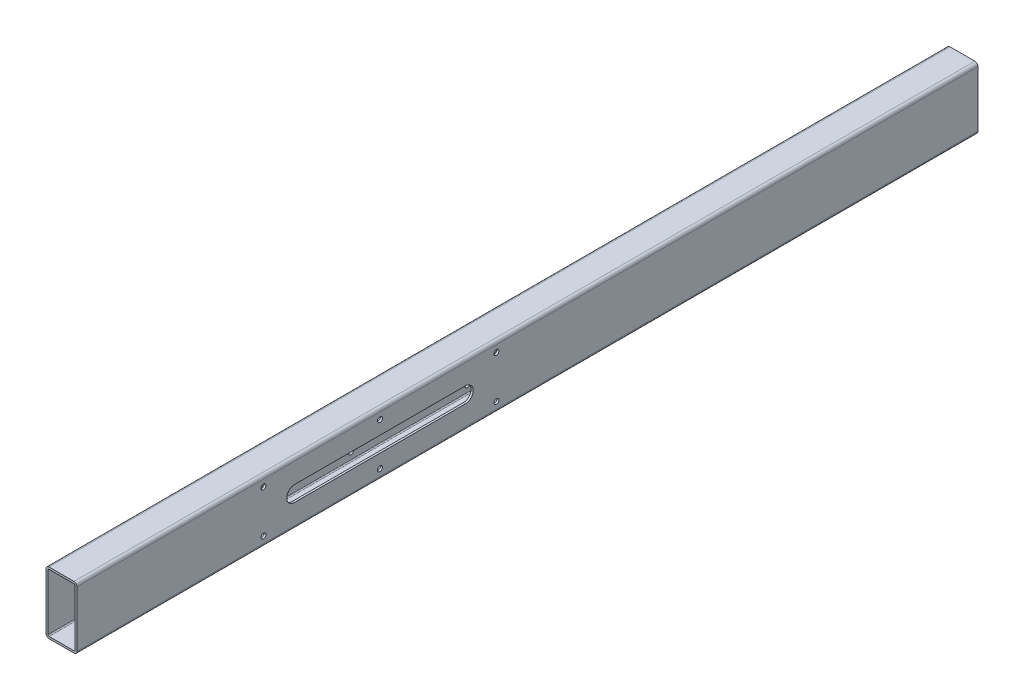
ISO-10303-21;
HEADER;
FILE_DESCRIPTION(('STEP AP214'),'2;1');
FILE_NAME('part.step','',(''),(''),'','','');
FILE_SCHEMA(('AUTOMOTIVE_DESIGN { 1 0 10303 214 1 1 1 1 }'));
ENDSEC;
DATA;
#1=APPLICATION_CONTEXT('core data for automotive mechanical design processes');
#2=APPLICATION_PROTOCOL_DEFINITION('international standard','automotive_design',2000,#1);
#3=PRODUCT_CONTEXT('',#1,'mechanical');
#4=PRODUCT('Part','Part','',(#3));
#5=PRODUCT_RELATED_PRODUCT_CATEGORY('part','',(#4));
#6=PRODUCT_DEFINITION_FORMATION('','',#4);
#7=PRODUCT_DEFINITION_CONTEXT('part definition',#1,'design');
#8=PRODUCT_DEFINITION('design','',#6,#7);
#9=PRODUCT_DEFINITION_SHAPE('','',#8);
#10=(LENGTH_UNIT() NAMED_UNIT(*) SI_UNIT(.MILLI.,.METRE.));
#11=(NAMED_UNIT(*) PLANE_ANGLE_UNIT() SI_UNIT($,.RADIAN.));
#12=(NAMED_UNIT(*) SI_UNIT($,.STERADIAN.) SOLID_ANGLE_UNIT());
#13=UNCERTAINTY_MEASURE_WITH_UNIT(LENGTH_MEASURE(1.E-05),#10,'distance_accuracy_value','');
#14=(GEOMETRIC_REPRESENTATION_CONTEXT(3) GLOBAL_UNCERTAINTY_ASSIGNED_CONTEXT((#13)) GLOBAL_UNIT_ASSIGNED_CONTEXT((#10,
#11,#12)) REPRESENTATION_CONTEXT('',''));
#15=CARTESIAN_POINT('',(0.,0.,0.));
#16=DIRECTION('',(0.,0.,1.));
#17=DIRECTION('',(1.,0.,0.));
#18=AXIS2_PLACEMENT_3D('',#15,#16,#17);
#19=CARTESIAN_POINT('',(-10.16,-22.86,736.6));
#20=DIRECTION('',(0.,0.,1.));
#21=DIRECTION('',(1.,0.,0.));
#22=AXIS2_PLACEMENT_3D('',#19,#20,#21);
#23=PLANE('',#22);
#24=CARTESIAN_POINT('',(-10.16,-22.86,736.6));
#25=DIRECTION('',(0.,0.,1.));
#26=DIRECTION('',(-1.,0.,0.));
#27=AXIS2_PLACEMENT_3D('',#24,#25,#26);
#28=CIRCLE('',#27,2.54);
#29=CARTESIAN_POINT('',(-12.7,-22.86,736.6));
#30=VERTEX_POINT('',#29);
#31=CARTESIAN_POINT('',(-10.16,-25.4,736.6));
#32=VERTEX_POINT('',#31);
#33=EDGE_CURVE('E414',#30,#32,#28,.T.);
#34=ORIENTED_EDGE('',*,*,#33,.T.);
#35=DIRECTION('',(1.,0.,0.));
#36=VECTOR('',#35,1.);
#37=CARTESIAN_POINT('',(10.16,-25.4,736.6));
#38=LINE('',#37,#36);
#39=CARTESIAN_POINT('',(10.16,-25.4,736.6));
#40=VERTEX_POINT('',#39);
#41=EDGE_CURVE('E418',#32,#40,#38,.T.);
#42=ORIENTED_EDGE('',*,*,#41,.T.);
#43=CARTESIAN_POINT('',(10.16,-22.86,736.6));
#44=DIRECTION('',(0.,0.,1.));
#45=DIRECTION('',(1.,0.,0.));
#46=AXIS2_PLACEMENT_3D('',#43,#44,#45);
#47=CIRCLE('',#46,2.54);
#48=CARTESIAN_POINT('',(12.7,-22.86,736.6));
#49=VERTEX_POINT('',#48);
#50=EDGE_CURVE('E422',#40,#49,#47,.T.);
#51=ORIENTED_EDGE('',*,*,#50,.T.);
#52=DIRECTION('',(0.,1.,0.));
#53=VECTOR('',#52,1.);
#54=CARTESIAN_POINT('',(12.7,-22.86,736.6));
#55=LINE('',#54,#53);
#56=CARTESIAN_POINT('',(12.7,22.86,736.6));
#57=VERTEX_POINT('',#56);
#58=EDGE_CURVE('E425',#49,#57,#55,.T.);
#59=ORIENTED_EDGE('',*,*,#58,.T.);
#60=CARTESIAN_POINT('',(10.16,22.86,736.6));
#61=DIRECTION('',(0.,0.,1.));
#62=DIRECTION('',(1.,0.,0.));
#63=AXIS2_PLACEMENT_3D('',#60,#61,#62);
#64=CIRCLE('',#63,2.54);
#65=CARTESIAN_POINT('',(10.16,25.4,736.6));
#66=VERTEX_POINT('',#65);
#67=EDGE_CURVE('E428',#57,#66,#64,.T.);
#68=ORIENTED_EDGE('',*,*,#67,.T.);
#69=DIRECTION('',(-1.,0.,0.));
#70=VECTOR('',#69,1.);
#71=CARTESIAN_POINT('',(10.16,25.4,736.6));
#72=LINE('',#71,#70);
#73=CARTESIAN_POINT('',(-10.16,25.4,736.6));
#74=VERTEX_POINT('',#73);
#75=EDGE_CURVE('E431',#66,#74,#72,.T.);
#76=ORIENTED_EDGE('',*,*,#75,.T.);
#77=CARTESIAN_POINT('',(-10.16,22.86,736.6));
#78=DIRECTION('',(0.,0.,1.));
#79=DIRECTION('',(1.,0.,0.));
#80=AXIS2_PLACEMENT_3D('',#77,#78,#79);
#81=CIRCLE('',#80,2.54);
#82=CARTESIAN_POINT('',(-12.7,22.86,736.6));
#83=VERTEX_POINT('',#82);
#84=EDGE_CURVE('E434',#74,#83,#81,.T.);
#85=ORIENTED_EDGE('',*,*,#84,.T.);
#86=DIRECTION('',(0.,-1.,0.));
#87=VECTOR('',#86,1.);
#88=CARTESIAN_POINT('',(-12.7,-22.86,736.6));
#89=LINE('',#88,#87);
#90=EDGE_CURVE('E437',#83,#30,#89,.T.);
#91=ORIENTED_EDGE('',*,*,#90,.T.);
#92=EDGE_LOOP('',(#34,#42,#51,#59,#68,#76,#85,#91));
#93=FACE_BOUND('',#92,.T.);
#94=DIRECTION('',(1.,0.,0.));
#95=VECTOR('',#94,1.);
#96=CARTESIAN_POINT('',(-10.16,-23.749,736.6));
#97=LINE('',#96,#95);
#98=CARTESIAN_POINT('',(-10.16,-23.749,736.6));
#99=VERTEX_POINT('',#98);
#100=CARTESIAN_POINT('',(10.16,-23.749,736.6));
#101=VERTEX_POINT('',#100);
#102=EDGE_CURVE('E334',#99,#101,#97,.T.);
#103=ORIENTED_EDGE('',*,*,#102,.F.);
#104=CARTESIAN_POINT('',(-10.16,-22.86,736.6));
#105=DIRECTION('',(0.,0.,-1.));
#106=DIRECTION('',(-1.,0.,0.));
#107=AXIS2_PLACEMENT_3D('',#104,#105,#106);
#108=CIRCLE('',#107,0.889);
#109=CARTESIAN_POINT('',(-11.049,-22.86,736.6));
#110=VERTEX_POINT('',#109);
#111=EDGE_CURVE('E331',#110,#99,#108,.F.);
#112=ORIENTED_EDGE('',*,*,#111,.F.);
#113=DIRECTION('',(0.,-1.,0.));
#114=VECTOR('',#113,1.);
#115=CARTESIAN_POINT('',(-11.049,-22.86,736.6));
#116=LINE('',#115,#114);
#117=CARTESIAN_POINT('',(-11.049,22.86,736.6));
#118=VERTEX_POINT('',#117);
#119=EDGE_CURVE('E354',#118,#110,#116,.T.);
#120=ORIENTED_EDGE('',*,*,#119,.F.);
#121=CARTESIAN_POINT('',(-10.16,22.86,736.6));
#122=DIRECTION('',(0.,0.,-1.));
#123=DIRECTION('',(-1.,0.,0.));
#124=AXIS2_PLACEMENT_3D('',#121,#122,#123);
#125=CIRCLE('',#124,0.889);
#126=CARTESIAN_POINT('',(-10.16,23.749,736.6));
#127=VERTEX_POINT('',#126);
#128=EDGE_CURVE('E350',#127,#118,#125,.F.);
#129=ORIENTED_EDGE('',*,*,#128,.F.);
#130=DIRECTION('',(-1.,0.,0.));
#131=VECTOR('',#130,1.);
#132=CARTESIAN_POINT('',(-10.16,23.749,736.6));
#133=LINE('',#132,#131);
#134=CARTESIAN_POINT('',(10.16,23.749,736.6));
#135=VERTEX_POINT('',#134);
#136=EDGE_CURVE('E347',#135,#127,#133,.T.);
#137=ORIENTED_EDGE('',*,*,#136,.F.);
#138=CARTESIAN_POINT('',(10.16,22.86,736.6));
#139=DIRECTION('',(0.,0.,-1.));
#140=DIRECTION('',(-1.,0.,0.));
#141=AXIS2_PLACEMENT_3D('',#138,#139,#140);
#142=CIRCLE('',#141,0.889);
#143=CARTESIAN_POINT('',(11.049,22.86,736.6));
#144=VERTEX_POINT('',#143);
#145=EDGE_CURVE('E344',#144,#135,#142,.F.);
#146=ORIENTED_EDGE('',*,*,#145,.F.);
#147=DIRECTION('',(0.,1.,0.));
#148=VECTOR('',#147,1.);
#149=CARTESIAN_POINT('',(11.049,-22.86,736.6));
#150=LINE('',#149,#148);
#151=CARTESIAN_POINT('',(11.049,-22.86,736.6));
#152=VERTEX_POINT('',#151);
#153=EDGE_CURVE('E341',#152,#144,#150,.T.);
#154=ORIENTED_EDGE('',*,*,#153,.F.);
#155=CARTESIAN_POINT('',(10.16,-22.86,736.6));
#156=DIRECTION('',(0.,0.,-1.));
#157=DIRECTION('',(-1.,0.,0.));
#158=AXIS2_PLACEMENT_3D('',#155,#156,#157);
#159=CIRCLE('',#158,0.889000000000001);
#160=EDGE_CURVE('E338',#101,#152,#159,.F.);
#161=ORIENTED_EDGE('',*,*,#160,.F.);
#162=EDGE_LOOP('',(#103,#112,#120,#129,#137,#146,#154,#161));
#163=FACE_BOUND('',#162,.T.);
#164=ADVANCED_FACE('F93',(#93,#163),#23,.T.);
#165=CARTESIAN_POINT('',(-10.16,-22.86,0.));
#166=DIRECTION('',(0.,0.,1.));
#167=DIRECTION('',(1.,0.,0.));
#168=AXIS2_PLACEMENT_3D('',#165,#166,#167);
#169=PLANE('',#168);
#170=CARTESIAN_POINT('',(-10.16,-22.86,0.));
#171=DIRECTION('',(0.,0.,1.));
#172=DIRECTION('',(-1.,0.,0.));
#173=AXIS2_PLACEMENT_3D('',#170,#171,#172);
#174=CIRCLE('',#173,2.54);
#175=CARTESIAN_POINT('',(-12.7,-22.86,0.));
#176=VERTEX_POINT('',#175);
#177=CARTESIAN_POINT('',(-10.16,-25.4,0.));
#178=VERTEX_POINT('',#177);
#179=EDGE_CURVE('E413',#176,#178,#174,.T.);
#180=ORIENTED_EDGE('',*,*,#179,.F.);
#181=DIRECTION('',(0.,-1.,0.));
#182=VECTOR('',#181,1.);
#183=CARTESIAN_POINT('',(-12.7,-22.86,0.));
#184=LINE('',#183,#182);
#185=CARTESIAN_POINT('',(-12.7,22.86,0.));
#186=VERTEX_POINT('',#185);
#187=EDGE_CURVE('E419',#186,#176,#184,.T.);
#188=ORIENTED_EDGE('',*,*,#187,.F.);
#189=CARTESIAN_POINT('',(-10.16,22.86,0.));
#190=DIRECTION('',(0.,0.,1.));
#191=DIRECTION('',(1.,0.,0.));
#192=AXIS2_PLACEMENT_3D('',#189,#190,#191);
#193=CIRCLE('',#192,2.54);
#194=CARTESIAN_POINT('',(-10.16,25.4,0.));
#195=VERTEX_POINT('',#194);
#196=EDGE_CURVE('E459',#195,#186,#193,.T.);
#197=ORIENTED_EDGE('',*,*,#196,.F.);
#198=DIRECTION('',(-1.,0.,0.));
#199=VECTOR('',#198,1.);
#200=CARTESIAN_POINT('',(10.16,25.4,0.));
#201=LINE('',#200,#199);
#202=CARTESIAN_POINT('',(10.16,25.4,0.));
#203=VERTEX_POINT('',#202);
#204=EDGE_CURVE('E456',#203,#195,#201,.T.);
#205=ORIENTED_EDGE('',*,*,#204,.F.);
#206=CARTESIAN_POINT('',(10.16,22.86,0.));
#207=DIRECTION('',(0.,0.,1.));
#208=DIRECTION('',(1.,0.,0.));
#209=AXIS2_PLACEMENT_3D('',#206,#207,#208);
#210=CIRCLE('',#209,2.54);
#211=CARTESIAN_POINT('',(12.7,22.86,0.));
#212=VERTEX_POINT('',#211);
#213=EDGE_CURVE('E453',#212,#203,#210,.T.);
#214=ORIENTED_EDGE('',*,*,#213,.F.);
#215=DIRECTION('',(0.,1.,0.));
#216=VECTOR('',#215,1.);
#217=CARTESIAN_POINT('',(12.7,-22.86,0.));
#218=LINE('',#217,#216);
#219=CARTESIAN_POINT('',(12.7,-22.86,0.));
#220=VERTEX_POINT('',#219);
#221=EDGE_CURVE('E450',#220,#212,#218,.T.);
#222=ORIENTED_EDGE('',*,*,#221,.F.);
#223=CARTESIAN_POINT('',(10.16,-22.86,0.));
#224=DIRECTION('',(0.,0.,1.));
#225=DIRECTION('',(1.,0.,0.));
#226=AXIS2_PLACEMENT_3D('',#223,#224,#225);
#227=CIRCLE('',#226,2.54);
#228=CARTESIAN_POINT('',(10.16,-25.4,0.));
#229=VERTEX_POINT('',#228);
#230=EDGE_CURVE('E447',#229,#220,#227,.T.);
#231=ORIENTED_EDGE('',*,*,#230,.F.);
#232=DIRECTION('',(1.,0.,0.));
#233=VECTOR('',#232,1.);
#234=CARTESIAN_POINT('',(10.16,-25.4,0.));
#235=LINE('',#234,#233);
#236=EDGE_CURVE('E444',#178,#229,#235,.T.);
#237=ORIENTED_EDGE('',*,*,#236,.F.);
#238=EDGE_LOOP('',(#180,#188,#197,#205,#214,#222,#231,#237));
#239=FACE_BOUND('',#238,.T.);
#240=CARTESIAN_POINT('',(-10.16,-22.86,0.));
#241=DIRECTION('',(0.,0.,-1.));
#242=DIRECTION('',(-1.,0.,0.));
#243=AXIS2_PLACEMENT_3D('',#240,#241,#242);
#244=CIRCLE('',#243,0.889);
#245=CARTESIAN_POINT('',(-11.049,-22.86,0.));
#246=VERTEX_POINT('',#245);
#247=CARTESIAN_POINT('',(-10.16,-23.749,0.));
#248=VERTEX_POINT('',#247);
#249=EDGE_CURVE('E330',#246,#248,#244,.F.);
#250=ORIENTED_EDGE('',*,*,#249,.T.);
#251=DIRECTION('',(1.,0.,0.));
#252=VECTOR('',#251,1.);
#253=CARTESIAN_POINT('',(-10.16,-23.749,0.));
#254=LINE('',#253,#252);
#255=CARTESIAN_POINT('',(10.16,-23.749,0.));
#256=VERTEX_POINT('',#255);
#257=EDGE_CURVE('E361',#248,#256,#254,.T.);
#258=ORIENTED_EDGE('',*,*,#257,.T.);
#259=CARTESIAN_POINT('',(10.16,-22.86,0.));
#260=DIRECTION('',(0.,0.,-1.));
#261=DIRECTION('',(-1.,0.,0.));
#262=AXIS2_PLACEMENT_3D('',#259,#260,#261);
#263=CIRCLE('',#262,0.889000000000001);
#264=CARTESIAN_POINT('',(11.049,-22.86,0.));
#265=VERTEX_POINT('',#264);
#266=EDGE_CURVE('E365',#256,#265,#263,.F.);
#267=ORIENTED_EDGE('',*,*,#266,.T.);
#268=DIRECTION('',(0.,1.,0.));
#269=VECTOR('',#268,1.);
#270=CARTESIAN_POINT('',(11.049,-22.86,0.));
#271=LINE('',#270,#269);
#272=CARTESIAN_POINT('',(11.049,22.86,0.));
#273=VERTEX_POINT('',#272);
#274=EDGE_CURVE('E369',#265,#273,#271,.T.);
#275=ORIENTED_EDGE('',*,*,#274,.T.);
#276=CARTESIAN_POINT('',(10.16,22.86,0.));
#277=DIRECTION('',(0.,0.,-1.));
#278=DIRECTION('',(-1.,0.,0.));
#279=AXIS2_PLACEMENT_3D('',#276,#277,#278);
#280=CIRCLE('',#279,0.889);
#281=CARTESIAN_POINT('',(10.16,23.749,0.));
#282=VERTEX_POINT('',#281);
#283=EDGE_CURVE('E373',#273,#282,#280,.F.);
#284=ORIENTED_EDGE('',*,*,#283,.T.);
#285=DIRECTION('',(-1.,0.,0.));
#286=VECTOR('',#285,1.);
#287=CARTESIAN_POINT('',(-10.16,23.749,0.));
#288=LINE('',#287,#286);
#289=CARTESIAN_POINT('',(-10.16,23.749,0.));
#290=VERTEX_POINT('',#289);
#291=EDGE_CURVE('E377',#282,#290,#288,.T.);
#292=ORIENTED_EDGE('',*,*,#291,.T.);
#293=CARTESIAN_POINT('',(-10.16,22.86,0.));
#294=DIRECTION('',(0.,0.,-1.));
#295=DIRECTION('',(-1.,0.,0.));
#296=AXIS2_PLACEMENT_3D('',#293,#294,#295);
#297=CIRCLE('',#296,0.889);
#298=CARTESIAN_POINT('',(-11.049,22.86,0.));
#299=VERTEX_POINT('',#298);
#300=EDGE_CURVE('E381',#290,#299,#297,.F.);
#301=ORIENTED_EDGE('',*,*,#300,.T.);
#302=DIRECTION('',(0.,-1.,0.));
#303=VECTOR('',#302,1.);
#304=CARTESIAN_POINT('',(-11.049,-22.86,0.));
#305=LINE('',#304,#303);
#306=EDGE_CURVE('E335',#299,#246,#305,.T.);
#307=ORIENTED_EDGE('',*,*,#306,.T.);
#308=EDGE_LOOP('',(#250,#258,#267,#275,#284,#292,#301,#307));
#309=FACE_BOUND('',#308,.T.);
#310=ADVANCED_FACE('F628',(#239,#309),#169,.F.);
#311=CARTESIAN_POINT('',(-10.16,-22.86,736.6));
#312=DIRECTION('',(0.,0.,-1.));
#313=DIRECTION('',(-1.,0.,0.));
#314=AXIS2_PLACEMENT_3D('',#311,#312,#313);
#315=CYLINDRICAL_SURFACE('',#314,2.54);
#316=ORIENTED_EDGE('',*,*,#179,.T.);
#317=DIRECTION('',(0.,0.,-1.));
#318=VECTOR('',#317,1.);
#319=CARTESIAN_POINT('',(-10.16,-25.4,736.6));
#320=LINE('',#319,#318);
#321=EDGE_CURVE('E491',#32,#178,#320,.T.);
#322=ORIENTED_EDGE('',*,*,#321,.F.);
#323=ORIENTED_EDGE('',*,*,#33,.F.);
#324=DIRECTION('',(0.,0.,-1.));
#325=VECTOR('',#324,1.);
#326=CARTESIAN_POINT('',(-12.7,-22.86,736.6));
#327=LINE('',#326,#325);
#328=EDGE_CURVE('E440',#30,#176,#327,.T.);
#329=ORIENTED_EDGE('',*,*,#328,.T.);
#330=EDGE_LOOP('',(#316,#322,#323,#329));
#331=FACE_BOUND('',#330,.T.);
#332=ADVANCED_FACE('F95',(#331),#315,.T.);
#333=CARTESIAN_POINT('',(10.16,-25.4,736.6));
#334=DIRECTION('',(0.,1.,0.));
#335=DIRECTION('',(-1.,0.,0.));
#336=AXIS2_PLACEMENT_3D('',#333,#334,#335);
#337=PLANE('',#336);
#338=ORIENTED_EDGE('',*,*,#236,.T.);
#339=DIRECTION('',(0.,0.,-1.));
#340=VECTOR('',#339,1.);
#341=CARTESIAN_POINT('',(10.16,-25.4,736.6));
#342=LINE('',#341,#340);
#343=EDGE_CURVE('E487',#40,#229,#342,.T.);
#344=ORIENTED_EDGE('',*,*,#343,.F.);
#345=ORIENTED_EDGE('',*,*,#41,.F.);
#346=ORIENTED_EDGE('',*,*,#321,.T.);
#347=EDGE_LOOP('',(#338,#344,#345,#346));
#348=FACE_BOUND('',#347,.T.);
#349=ADVANCED_FACE('F657',(#348),#337,.F.);
#350=CARTESIAN_POINT('',(10.16,-22.86,736.6));
#351=DIRECTION('',(0.,0.,-1.));
#352=DIRECTION('',(-1.,0.,0.));
#353=AXIS2_PLACEMENT_3D('',#350,#351,#352);
#354=CYLINDRICAL_SURFACE('',#353,2.54);
#355=ORIENTED_EDGE('',*,*,#230,.T.);
#356=DIRECTION('',(0.,0.,-1.));
#357=VECTOR('',#356,1.);
#358=CARTESIAN_POINT('',(12.7,-22.86,736.6));
#359=LINE('',#358,#357);
#360=EDGE_CURVE('E483',#49,#220,#359,.T.);
#361=ORIENTED_EDGE('',*,*,#360,.F.);
#362=ORIENTED_EDGE('',*,*,#50,.F.);
#363=ORIENTED_EDGE('',*,*,#343,.T.);
#364=EDGE_LOOP('',(#355,#361,#362,#363));
#365=FACE_BOUND('',#364,.T.);
#366=ADVANCED_FACE('F600',(#365),#354,.T.);
#367=CARTESIAN_POINT('',(12.7,-22.86,736.6));
#368=DIRECTION('',(-1.,0.,0.));
#369=DIRECTION('',(0.,0.,1.));
#370=AXIS2_PLACEMENT_3D('',#367,#368,#369);
#371=PLANE('',#370);
#372=CARTESIAN_POINT('',(12.7,-17.399,584.2));
#373=DIRECTION('',(1.,0.,0.));
#374=DIRECTION('',(0.,0.,-1.));
#375=AXIS2_PLACEMENT_3D('',#372,#373,#374);
#376=CIRCLE('',#375,2.01929999999992);
#377=CARTESIAN_POINT('',(12.7,-17.399,582.1807));
#378=VERTEX_POINT('',#377);
#379=EDGE_CURVE('E575',#378,#378,#376,.T.);
#380=ORIENTED_EDGE('',*,*,#379,.F.);
#381=EDGE_LOOP('',(#380));
#382=FACE_BOUND('',#381,.T.);
#383=CARTESIAN_POINT('',(12.7,-17.399,488.95));
#384=DIRECTION('',(1.,0.,0.));
#385=DIRECTION('',(0.,0.,-1.));
#386=AXIS2_PLACEMENT_3D('',#383,#384,#385);
#387=CIRCLE('',#386,2.01929999999998);
#388=CARTESIAN_POINT('',(12.7,-17.399,486.9307));
#389=VERTEX_POINT('',#388);
#390=EDGE_CURVE('E560',#389,#389,#387,.T.);
#391=ORIENTED_EDGE('',*,*,#390,.F.);
#392=EDGE_LOOP('',(#391));
#393=FACE_BOUND('',#392,.T.);
#394=CARTESIAN_POINT('',(12.7,17.399,488.95));
#395=DIRECTION('',(1.,0.,0.));
#396=DIRECTION('',(0.,0.,-1.));
#397=AXIS2_PLACEMENT_3D('',#394,#395,#396);
#398=CIRCLE('',#397,2.01929999999998);
#399=CARTESIAN_POINT('',(12.7,17.399,486.9307));
#400=VERTEX_POINT('',#399);
#401=EDGE_CURVE('E559',#400,#400,#398,.T.);
#402=ORIENTED_EDGE('',*,*,#401,.F.);
#403=EDGE_LOOP('',(#402));
#404=FACE_BOUND('',#403,.T.);
#405=CARTESIAN_POINT('',(12.7,-17.399,393.7));
#406=DIRECTION('',(1.,0.,0.));
#407=DIRECTION('',(0.,0.,-1.));
#408=AXIS2_PLACEMENT_3D('',#405,#406,#407);
#409=CIRCLE('',#408,2.01929999999998);
#410=CARTESIAN_POINT('',(12.7,-17.399,391.6807));
#411=VERTEX_POINT('',#410);
#412=EDGE_CURVE('E551',#411,#411,#409,.T.);
#413=ORIENTED_EDGE('',*,*,#412,.F.);
#414=EDGE_LOOP('',(#413));
#415=FACE_BOUND('',#414,.T.);
#416=CARTESIAN_POINT('',(12.7,17.399,584.2));
#417=DIRECTION('',(1.,0.,0.));
#418=DIRECTION('',(0.,0.,-1.));
#419=AXIS2_PLACEMENT_3D('',#416,#417,#418);
#420=CIRCLE('',#419,2.01929999999992);
#421=CARTESIAN_POINT('',(12.7,17.399,582.1807));
#422=VERTEX_POINT('',#421);
#423=EDGE_CURVE('E576',#422,#422,#420,.T.);
#424=ORIENTED_EDGE('',*,*,#423,.F.);
#425=EDGE_LOOP('',(#424));
#426=FACE_BOUND('',#425,.T.);
#427=CARTESIAN_POINT('',(12.7,17.399,393.7));
#428=DIRECTION('',(1.,0.,0.));
#429=DIRECTION('',(0.,0.,-1.));
#430=AXIS2_PLACEMENT_3D('',#427,#428,#429);
#431=CIRCLE('',#430,2.01929999999998);
#432=CARTESIAN_POINT('',(12.7,17.399,391.6807));
#433=VERTEX_POINT('',#432);
#434=EDGE_CURVE('E547',#433,#433,#431,.T.);
#435=ORIENTED_EDGE('',*,*,#434,.F.);
#436=EDGE_LOOP('',(#435));
#437=FACE_BOUND('',#436,.T.);
#438=DIRECTION('',(0.,0.,1.));
#439=VECTOR('',#438,1.);
#440=CARTESIAN_POINT('',(12.7,-6.35,558.8));
#441=LINE('',#440,#439);
#442=CARTESIAN_POINT('',(12.7,-6.35000000000002,419.1));
#443=VERTEX_POINT('',#442);
#444=CARTESIAN_POINT('',(12.7,-6.35,558.8));
#445=VERTEX_POINT('',#444);
#446=EDGE_CURVE('E283',#443,#445,#441,.T.);
#447=ORIENTED_EDGE('',*,*,#446,.T.);
#448=CARTESIAN_POINT('',(12.7,0.,558.8));
#449=DIRECTION('',(-1.,0.,0.));
#450=DIRECTION('',(0.,0.,1.));
#451=AXIS2_PLACEMENT_3D('',#448,#449,#450);
#452=CIRCLE('',#451,6.35);
#453=CARTESIAN_POINT('',(12.7,6.35,558.8));
#454=VERTEX_POINT('',#453);
#455=EDGE_CURVE('E263',#445,#454,#452,.T.);
#456=ORIENTED_EDGE('',*,*,#455,.T.);
#457=DIRECTION('',(0.,0.,-1.));
#458=VECTOR('',#457,1.);
#459=CARTESIAN_POINT('',(12.7,6.35,558.8));
#460=LINE('',#459,#458);
#461=CARTESIAN_POINT('',(12.7,6.34999999999998,419.1));
#462=VERTEX_POINT('',#461);
#463=EDGE_CURVE('E274',#454,#462,#460,.T.);
#464=ORIENTED_EDGE('',*,*,#463,.T.);
#465=CARTESIAN_POINT('',(12.7,0.,419.1));
#466=DIRECTION('',(-1.,0.,0.));
#467=DIRECTION('',(0.,0.,1.));
#468=AXIS2_PLACEMENT_3D('',#465,#466,#467);
#469=CIRCLE('',#468,6.35);
#470=EDGE_CURVE('E111',#462,#443,#469,.T.);
#471=ORIENTED_EDGE('',*,*,#470,.T.);
#472=EDGE_LOOP('',(#447,#456,#464,#471));
#473=FACE_BOUND('',#472,.T.);
#474=ORIENTED_EDGE('',*,*,#221,.T.);
#475=DIRECTION('',(0.,0.,-1.));
#476=VECTOR('',#475,1.);
#477=CARTESIAN_POINT('',(12.7,22.86,736.6));
#478=LINE('',#477,#476);
#479=EDGE_CURVE('E479',#57,#212,#478,.T.);
#480=ORIENTED_EDGE('',*,*,#479,.F.);
#481=ORIENTED_EDGE('',*,*,#58,.F.);
#482=ORIENTED_EDGE('',*,*,#360,.T.);
#483=EDGE_LOOP('',(#474,#480,#481,#482));
#484=FACE_BOUND('',#483,.T.);
#485=ADVANCED_FACE('F280',(#382,#393,#404,#415,#426,#437,#473,#484),#371,.F.);
#486=CARTESIAN_POINT('',(10.16,22.86,736.6));
#487=DIRECTION('',(0.,0.,-1.));
#488=DIRECTION('',(-1.,0.,0.));
#489=AXIS2_PLACEMENT_3D('',#486,#487,#488);
#490=CYLINDRICAL_SURFACE('',#489,2.54);
#491=ORIENTED_EDGE('',*,*,#213,.T.);
#492=DIRECTION('',(0.,0.,-1.));
#493=VECTOR('',#492,1.);
#494=CARTESIAN_POINT('',(10.16,25.4,736.6));
#495=LINE('',#494,#493);
#496=EDGE_CURVE('E475',#66,#203,#495,.T.);
#497=ORIENTED_EDGE('',*,*,#496,.F.);
#498=ORIENTED_EDGE('',*,*,#67,.F.);
#499=ORIENTED_EDGE('',*,*,#479,.T.);
#500=EDGE_LOOP('',(#491,#497,#498,#499));
#501=FACE_BOUND('',#500,.T.);
#502=ADVANCED_FACE('F599',(#501),#490,.T.);
#503=CARTESIAN_POINT('',(10.16,25.4,736.6));
#504=DIRECTION('',(0.,-1.,0.));
#505=DIRECTION('',(0.,0.,-1.));
#506=AXIS2_PLACEMENT_3D('',#503,#504,#505);
#507=PLANE('',#506);
#508=ORIENTED_EDGE('',*,*,#204,.T.);
#509=DIRECTION('',(0.,0.,-1.));
#510=VECTOR('',#509,1.);
#511=CARTESIAN_POINT('',(-10.16,25.4,736.6));
#512=LINE('',#511,#510);
#513=EDGE_CURVE('E471',#74,#195,#512,.T.);
#514=ORIENTED_EDGE('',*,*,#513,.F.);
#515=ORIENTED_EDGE('',*,*,#75,.F.);
#516=ORIENTED_EDGE('',*,*,#496,.T.);
#517=EDGE_LOOP('',(#508,#514,#515,#516));
#518=FACE_BOUND('',#517,.T.);
#519=ADVANCED_FACE('F648',(#518),#507,.F.);
#520=CARTESIAN_POINT('',(-10.16,22.86,736.6));
#521=DIRECTION('',(0.,0.,-1.));
#522=DIRECTION('',(-1.,0.,0.));
#523=AXIS2_PLACEMENT_3D('',#520,#521,#522);
#524=CYLINDRICAL_SURFACE('',#523,2.54);
#525=ORIENTED_EDGE('',*,*,#196,.T.);
#526=DIRECTION('',(0.,0.,-1.));
#527=VECTOR('',#526,1.);
#528=CARTESIAN_POINT('',(-12.7,22.86,736.6));
#529=LINE('',#528,#527);
#530=EDGE_CURVE('E467',#83,#186,#529,.T.);
#531=ORIENTED_EDGE('',*,*,#530,.F.);
#532=ORIENTED_EDGE('',*,*,#84,.F.);
#533=ORIENTED_EDGE('',*,*,#513,.T.);
#534=EDGE_LOOP('',(#525,#531,#532,#533));
#535=FACE_BOUND('',#534,.T.);
#536=ADVANCED_FACE('F644',(#535),#524,.T.);
#537=CARTESIAN_POINT('',(-12.7,-22.86,736.6));
#538=DIRECTION('',(1.,0.,0.));
#539=DIRECTION('',(0.,0.,-1.));
#540=AXIS2_PLACEMENT_3D('',#537,#538,#539);
#541=PLANE('',#540);
#542=CARTESIAN_POINT('',(-12.7,-17.399,584.2));
#543=DIRECTION('',(1.,0.,0.));
#544=DIRECTION('',(0.,0.,-1.));
#545=AXIS2_PLACEMENT_3D('',#542,#543,#544);
#546=CIRCLE('',#545,2.01929999999992);
#547=CARTESIAN_POINT('',(-12.7,-17.399,582.1807));
#548=VERTEX_POINT('',#547);
#549=EDGE_CURVE('E571',#548,#548,#546,.T.);
#550=ORIENTED_EDGE('',*,*,#549,.T.);
#551=EDGE_LOOP('',(#550));
#552=FACE_BOUND('',#551,.T.);
#553=CARTESIAN_POINT('',(-12.7,-17.399,488.95));
#554=DIRECTION('',(1.,0.,0.));
#555=DIRECTION('',(0.,0.,-1.));
#556=AXIS2_PLACEMENT_3D('',#553,#554,#555);
#557=CIRCLE('',#556,2.01929999999998);
#558=CARTESIAN_POINT('',(-12.7,-17.399,486.9307));
#559=VERTEX_POINT('',#558);
#560=EDGE_CURVE('E580',#559,#559,#557,.T.);
#561=ORIENTED_EDGE('',*,*,#560,.T.);
#562=EDGE_LOOP('',(#561));
#563=FACE_BOUND('',#562,.T.);
#564=CARTESIAN_POINT('',(-12.7,17.399,488.95));
#565=DIRECTION('',(1.,0.,0.));
#566=DIRECTION('',(0.,0.,-1.));
#567=AXIS2_PLACEMENT_3D('',#564,#565,#566);
#568=CIRCLE('',#567,2.01929999999998);
#569=CARTESIAN_POINT('',(-12.7,17.399,486.9307));
#570=VERTEX_POINT('',#569);
#571=EDGE_CURVE('E555',#570,#570,#568,.T.);
#572=ORIENTED_EDGE('',*,*,#571,.T.);
#573=EDGE_LOOP('',(#572));
#574=FACE_BOUND('',#573,.T.);
#575=CARTESIAN_POINT('',(-12.7,-17.399,393.7));
#576=DIRECTION('',(1.,0.,0.));
#577=DIRECTION('',(0.,0.,-1.));
#578=AXIS2_PLACEMENT_3D('',#575,#576,#577);
#579=CIRCLE('',#578,2.01929999999998);
#580=CARTESIAN_POINT('',(-12.7,-17.399,391.6807));
#581=VERTEX_POINT('',#580);
#582=EDGE_CURVE('E564',#581,#581,#579,.T.);
#583=ORIENTED_EDGE('',*,*,#582,.T.);
#584=EDGE_LOOP('',(#583));
#585=FACE_BOUND('',#584,.T.);
#586=CARTESIAN_POINT('',(-12.7,17.399,584.2));
#587=DIRECTION('',(1.,0.,0.));
#588=DIRECTION('',(0.,0.,-1.));
#589=AXIS2_PLACEMENT_3D('',#586,#587,#588);
#590=CIRCLE('',#589,2.01929999999992);
#591=CARTESIAN_POINT('',(-12.7,17.399,582.1807));
#592=VERTEX_POINT('',#591);
#593=EDGE_CURVE('E587',#592,#592,#590,.T.);
#594=ORIENTED_EDGE('',*,*,#593,.T.);
#595=EDGE_LOOP('',(#594));
#596=FACE_BOUND('',#595,.T.);
#597=CARTESIAN_POINT('',(-12.7,17.399,393.7));
#598=DIRECTION('',(1.,0.,0.));
#599=DIRECTION('',(0.,0.,-1.));
#600=AXIS2_PLACEMENT_3D('',#597,#598,#599);
#601=CIRCLE('',#600,2.01929999999998);
#602=CARTESIAN_POINT('',(-12.7,17.399,391.6807));
#603=VERTEX_POINT('',#602);
#604=EDGE_CURVE('E509',#603,#603,#601,.T.);
#605=ORIENTED_EDGE('',*,*,#604,.T.);
#606=EDGE_LOOP('',(#605));
#607=FACE_BOUND('',#606,.T.);
#608=DIRECTION('',(0.,0.,-1.));
#609=VECTOR('',#608,1.);
#610=CARTESIAN_POINT('',(-12.7,6.35,558.8));
#611=LINE('',#610,#609);
#612=CARTESIAN_POINT('',(-12.7,6.35,558.8));
#613=VERTEX_POINT('',#612);
#614=CARTESIAN_POINT('',(-12.7,6.34999999999998,419.1));
#615=VERTEX_POINT('',#614);
#616=EDGE_CURVE('E301',#613,#615,#611,.T.);
#617=ORIENTED_EDGE('',*,*,#616,.F.);
#618=CARTESIAN_POINT('',(-12.7,0.,558.8));
#619=DIRECTION('',(-1.,0.,0.));
#620=DIRECTION('',(0.,0.,1.));
#621=AXIS2_PLACEMENT_3D('',#618,#619,#620);
#622=CIRCLE('',#621,6.35);
#623=CARTESIAN_POINT('',(-12.7,-6.35,558.8));
#624=VERTEX_POINT('',#623);
#625=EDGE_CURVE('E119',#624,#613,#622,.T.);
#626=ORIENTED_EDGE('',*,*,#625,.F.);
#627=DIRECTION('',(0.,0.,1.));
#628=VECTOR('',#627,1.);
#629=CARTESIAN_POINT('',(-12.7,-6.35,558.8));
#630=LINE('',#629,#628);
#631=CARTESIAN_POINT('',(-12.7,-6.35000000000002,419.1));
#632=VERTEX_POINT('',#631);
#633=EDGE_CURVE('E285',#632,#624,#630,.T.);
#634=ORIENTED_EDGE('',*,*,#633,.F.);
#635=CARTESIAN_POINT('',(-12.7,0.,419.1));
#636=DIRECTION('',(-1.,0.,0.));
#637=DIRECTION('',(0.,0.,1.));
#638=AXIS2_PLACEMENT_3D('',#635,#636,#637);
#639=CIRCLE('',#638,6.35);
#640=EDGE_CURVE('E289',#615,#632,#639,.T.);
#641=ORIENTED_EDGE('',*,*,#640,.F.);
#642=EDGE_LOOP('',(#617,#626,#634,#641));
#643=FACE_BOUND('',#642,.T.);
#644=ORIENTED_EDGE('',*,*,#187,.T.);
#645=ORIENTED_EDGE('',*,*,#328,.F.);
#646=ORIENTED_EDGE('',*,*,#90,.F.);
#647=ORIENTED_EDGE('',*,*,#530,.T.);
#648=EDGE_LOOP('',(#644,#645,#646,#647));
#649=FACE_BOUND('',#648,.T.);
#650=ADVANCED_FACE('F641',(#552,#563,#574,#585,#596,#607,#643,#649),#541,.F.);
#651=CARTESIAN_POINT('',(-10.16,-22.86,736.6));
#652=DIRECTION('',(0.,0.,-1.));
#653=DIRECTION('',(-1.,0.,0.));
#654=AXIS2_PLACEMENT_3D('',#651,#652,#653);
#655=CYLINDRICAL_SURFACE('',#654,0.889);
#656=ORIENTED_EDGE('',*,*,#249,.F.);
#657=DIRECTION('',(0.,0.,-1.));
#658=VECTOR('',#657,1.);
#659=CARTESIAN_POINT('',(-11.049,-22.86,736.6));
#660=LINE('',#659,#658);
#661=EDGE_CURVE('E357',#110,#246,#660,.T.);
#662=ORIENTED_EDGE('',*,*,#661,.F.);
#663=ORIENTED_EDGE('',*,*,#111,.T.);
#664=DIRECTION('',(0.,0.,-1.));
#665=VECTOR('',#664,1.);
#666=CARTESIAN_POINT('',(-10.16,-23.749,736.6));
#667=LINE('',#666,#665);
#668=EDGE_CURVE('E409',#99,#248,#667,.T.);
#669=ORIENTED_EDGE('',*,*,#668,.T.);
#670=EDGE_LOOP('',(#656,#662,#663,#669));
#671=FACE_BOUND('',#670,.T.);
#672=ADVANCED_FACE('F638',(#671),#655,.F.);
#673=CARTESIAN_POINT('',(-10.16,-23.749,736.6));
#674=DIRECTION('',(0.,1.,0.));
#675=DIRECTION('',(-1.,0.,0.));
#676=AXIS2_PLACEMENT_3D('',#673,#674,#675);
#677=PLANE('',#676);
#678=ORIENTED_EDGE('',*,*,#257,.F.);
#679=ORIENTED_EDGE('',*,*,#668,.F.);
#680=ORIENTED_EDGE('',*,*,#102,.T.);
#681=DIRECTION('',(0.,0.,-1.));
#682=VECTOR('',#681,1.);
#683=CARTESIAN_POINT('',(10.16,-23.749,736.6));
#684=LINE('',#683,#682);
#685=EDGE_CURVE('E406',#101,#256,#684,.T.);
#686=ORIENTED_EDGE('',*,*,#685,.T.);
#687=EDGE_LOOP('',(#678,#679,#680,#686));
#688=FACE_BOUND('',#687,.T.);
#689=ADVANCED_FACE('F702',(#688),#677,.T.);
#690=CARTESIAN_POINT('',(10.16,-22.86,736.6));
#691=DIRECTION('',(0.,0.,-1.));
#692=DIRECTION('',(-1.,0.,0.));
#693=AXIS2_PLACEMENT_3D('',#690,#691,#692);
#694=CYLINDRICAL_SURFACE('',#693,0.889000000000001);
#695=ORIENTED_EDGE('',*,*,#266,.F.);
#696=ORIENTED_EDGE('',*,*,#685,.F.);
#697=ORIENTED_EDGE('',*,*,#160,.T.);
#698=DIRECTION('',(0.,0.,-1.));
#699=VECTOR('',#698,1.);
#700=CARTESIAN_POINT('',(11.049,-22.86,736.6));
#701=LINE('',#700,#699);
#702=EDGE_CURVE('E403',#152,#265,#701,.T.);
#703=ORIENTED_EDGE('',*,*,#702,.T.);
#704=EDGE_LOOP('',(#695,#696,#697,#703));
#705=FACE_BOUND('',#704,.T.);
#706=ADVANCED_FACE('F706',(#705),#694,.F.);
#707=CARTESIAN_POINT('',(11.049,-22.86,736.6));
#708=DIRECTION('',(-1.,0.,0.));
#709=DIRECTION('',(0.,0.,1.));
#710=AXIS2_PLACEMENT_3D('',#707,#708,#709);
#711=PLANE('',#710);
#712=CARTESIAN_POINT('',(11.049,-17.399,584.2));
#713=DIRECTION('',(-1.,0.,0.));
#714=DIRECTION('',(0.,0.,1.));
#715=AXIS2_PLACEMENT_3D('',#712,#713,#714);
#716=CIRCLE('',#715,2.01929999999992);
#717=CARTESIAN_POINT('',(11.049,-17.399,586.2193));
#718=VERTEX_POINT('',#717);
#719=EDGE_CURVE('E292',#718,#718,#716,.T.);
#720=ORIENTED_EDGE('',*,*,#719,.F.);
#721=EDGE_LOOP('',(#720));
#722=FACE_BOUND('',#721,.T.);
#723=CARTESIAN_POINT('',(11.049,-17.399,488.95));
#724=DIRECTION('',(-1.,0.,0.));
#725=DIRECTION('',(0.,0.,1.));
#726=AXIS2_PLACEMENT_3D('',#723,#724,#725);
#727=CIRCLE('',#726,2.01929999999998);
#728=CARTESIAN_POINT('',(11.049,-17.399,490.9693));
#729=VERTEX_POINT('',#728);
#730=EDGE_CURVE('E527',#729,#729,#727,.T.);
#731=ORIENTED_EDGE('',*,*,#730,.F.);
#732=EDGE_LOOP('',(#731));
#733=FACE_BOUND('',#732,.T.);
#734=CARTESIAN_POINT('',(11.049,17.399,488.95));
#735=DIRECTION('',(-1.,0.,0.));
#736=DIRECTION('',(0.,0.,1.));
#737=AXIS2_PLACEMENT_3D('',#734,#735,#736);
#738=CIRCLE('',#737,2.01929999999998);
#739=CARTESIAN_POINT('',(11.049,17.399,490.9693));
#740=VERTEX_POINT('',#739);
#741=EDGE_CURVE('E523',#740,#740,#738,.T.);
#742=ORIENTED_EDGE('',*,*,#741,.F.);
#743=EDGE_LOOP('',(#742));
#744=FACE_BOUND('',#743,.T.);
#745=CARTESIAN_POINT('',(11.049,-17.399,393.7));
#746=DIRECTION('',(-1.,0.,0.));
#747=DIRECTION('',(0.,0.,1.));
#748=AXIS2_PLACEMENT_3D('',#745,#746,#747);
#749=CIRCLE('',#748,2.01929999999998);
#750=CARTESIAN_POINT('',(11.049,-17.399,395.7193));
#751=VERTEX_POINT('',#750);
#752=EDGE_CURVE('E519',#751,#751,#749,.T.);
#753=ORIENTED_EDGE('',*,*,#752,.F.);
#754=EDGE_LOOP('',(#753));
#755=FACE_BOUND('',#754,.T.);
#756=CARTESIAN_POINT('',(11.049,17.399,584.2));
#757=DIRECTION('',(-1.,0.,0.));
#758=DIRECTION('',(0.,0.,1.));
#759=AXIS2_PLACEMENT_3D('',#756,#757,#758);
#760=CIRCLE('',#759,2.01929999999992);
#761=CARTESIAN_POINT('',(11.049,17.399,586.2193));
#762=VERTEX_POINT('',#761);
#763=EDGE_CURVE('E514',#762,#762,#760,.T.);
#764=ORIENTED_EDGE('',*,*,#763,.F.);
#765=EDGE_LOOP('',(#764));
#766=FACE_BOUND('',#765,.T.);
#767=CARTESIAN_POINT('',(11.049,17.399,393.7));
#768=DIRECTION('',(-1.,0.,0.));
#769=DIRECTION('',(0.,0.,1.));
#770=AXIS2_PLACEMENT_3D('',#767,#768,#769);
#771=CIRCLE('',#770,2.01929999999998);
#772=CARTESIAN_POINT('',(11.049,17.399,395.7193));
#773=VERTEX_POINT('',#772);
#774=EDGE_CURVE('E508',#773,#773,#771,.T.);
#775=ORIENTED_EDGE('',*,*,#774,.F.);
#776=EDGE_LOOP('',(#775));
#777=FACE_BOUND('',#776,.T.);
#778=CARTESIAN_POINT('',(11.049,0.,558.8));
#779=DIRECTION('',(-1.,0.,0.));
#780=DIRECTION('',(0.,0.,1.));
#781=AXIS2_PLACEMENT_3D('',#778,#779,#780);
#782=CIRCLE('',#781,6.35);
#783=CARTESIAN_POINT('',(11.049,-6.35,558.8));
#784=VERTEX_POINT('',#783);
#785=CARTESIAN_POINT('',(11.049,6.35,558.8));
#786=VERTEX_POINT('',#785);
#787=EDGE_CURVE('E266',#784,#786,#782,.T.);
#788=ORIENTED_EDGE('',*,*,#787,.F.);
#789=DIRECTION('',(0.,0.,1.));
#790=VECTOR('',#789,1.);
#791=CARTESIAN_POINT('',(11.049,-6.34999999999997,736.6));
#792=LINE('',#791,#790);
#793=CARTESIAN_POINT('',(11.049,-6.35000000000002,419.1));
#794=VERTEX_POINT('',#793);
#795=EDGE_CURVE('E325',#794,#784,#792,.T.);
#796=ORIENTED_EDGE('',*,*,#795,.F.);
#797=CARTESIAN_POINT('',(11.049,0.,419.1));
#798=DIRECTION('',(-1.,0.,0.));
#799=DIRECTION('',(0.,0.,1.));
#800=AXIS2_PLACEMENT_3D('',#797,#798,#799);
#801=CIRCLE('',#800,6.35);
#802=CARTESIAN_POINT('',(11.049,6.34999999999998,419.1));
#803=VERTEX_POINT('',#802);
#804=EDGE_CURVE('E322',#803,#794,#801,.T.);
#805=ORIENTED_EDGE('',*,*,#804,.F.);
#806=DIRECTION('',(0.,0.,-1.));
#807=VECTOR('',#806,1.);
#808=CARTESIAN_POINT('',(11.049,6.35000000000002,736.6));
#809=LINE('',#808,#807);
#810=EDGE_CURVE('E311',#786,#803,#809,.T.);
#811=ORIENTED_EDGE('',*,*,#810,.F.);
#812=EDGE_LOOP('',(#788,#796,#805,#811));
#813=FACE_BOUND('',#812,.T.);
#814=ORIENTED_EDGE('',*,*,#274,.F.);
#815=ORIENTED_EDGE('',*,*,#702,.F.);
#816=ORIENTED_EDGE('',*,*,#153,.T.);
#817=DIRECTION('',(0.,0.,-1.));
#818=VECTOR('',#817,1.);
#819=CARTESIAN_POINT('',(11.049,22.86,736.6));
#820=LINE('',#819,#818);
#821=EDGE_CURVE('E400',#144,#273,#820,.T.);
#822=ORIENTED_EDGE('',*,*,#821,.T.);
#823=EDGE_LOOP('',(#814,#815,#816,#822));
#824=FACE_BOUND('',#823,.T.);
#825=ADVANCED_FACE('F711',(#722,#733,#744,#755,#766,#777,#813,#824),#711,.T.);
#826=CARTESIAN_POINT('',(10.16,22.86,736.6));
#827=DIRECTION('',(0.,0.,-1.));
#828=DIRECTION('',(-1.,0.,0.));
#829=AXIS2_PLACEMENT_3D('',#826,#827,#828);
#830=CYLINDRICAL_SURFACE('',#829,0.889);
#831=ORIENTED_EDGE('',*,*,#283,.F.);
#832=ORIENTED_EDGE('',*,*,#821,.F.);
#833=ORIENTED_EDGE('',*,*,#145,.T.);
#834=DIRECTION('',(0.,0.,-1.));
#835=VECTOR('',#834,1.);
#836=CARTESIAN_POINT('',(10.16,23.749,736.6));
#837=LINE('',#836,#835);
#838=EDGE_CURVE('E397',#135,#282,#837,.T.);
#839=ORIENTED_EDGE('',*,*,#838,.T.);
#840=EDGE_LOOP('',(#831,#832,#833,#839));
#841=FACE_BOUND('',#840,.T.);
#842=ADVANCED_FACE('F716',(#841),#830,.F.);
#843=CARTESIAN_POINT('',(-10.16,23.749,736.6));
#844=DIRECTION('',(0.,-1.,0.));
#845=DIRECTION('',(0.,0.,-1.));
#846=AXIS2_PLACEMENT_3D('',#843,#844,#845);
#847=PLANE('',#846);
#848=ORIENTED_EDGE('',*,*,#291,.F.);
#849=ORIENTED_EDGE('',*,*,#838,.F.);
#850=ORIENTED_EDGE('',*,*,#136,.T.);
#851=DIRECTION('',(0.,0.,-1.));
#852=VECTOR('',#851,1.);
#853=CARTESIAN_POINT('',(-10.16,23.749,736.6));
#854=LINE('',#853,#852);
#855=EDGE_CURVE('E394',#127,#290,#854,.T.);
#856=ORIENTED_EDGE('',*,*,#855,.T.);
#857=EDGE_LOOP('',(#848,#849,#850,#856));
#858=FACE_BOUND('',#857,.T.);
#859=ADVANCED_FACE('F720',(#858),#847,.T.);
#860=CARTESIAN_POINT('',(-10.16,22.86,736.6));
#861=DIRECTION('',(0.,0.,-1.));
#862=DIRECTION('',(-1.,0.,0.));
#863=AXIS2_PLACEMENT_3D('',#860,#861,#862);
#864=CYLINDRICAL_SURFACE('',#863,0.889);
#865=ORIENTED_EDGE('',*,*,#300,.F.);
#866=ORIENTED_EDGE('',*,*,#855,.F.);
#867=ORIENTED_EDGE('',*,*,#128,.T.);
#868=DIRECTION('',(0.,0.,-1.));
#869=VECTOR('',#868,1.);
#870=CARTESIAN_POINT('',(-11.049,22.86,736.6));
#871=LINE('',#870,#869);
#872=EDGE_CURVE('E391',#118,#299,#871,.T.);
#873=ORIENTED_EDGE('',*,*,#872,.T.);
#874=EDGE_LOOP('',(#865,#866,#867,#873));
#875=FACE_BOUND('',#874,.T.);
#876=ADVANCED_FACE('F724',(#875),#864,.F.);
#877=CARTESIAN_POINT('',(-11.049,-22.86,736.6));
#878=DIRECTION('',(1.,0.,0.));
#879=DIRECTION('',(0.,0.,-1.));
#880=AXIS2_PLACEMENT_3D('',#877,#878,#879);
#881=PLANE('',#880);
#882=CARTESIAN_POINT('',(-11.049,-17.399,584.2));
#883=DIRECTION('',(1.,0.,0.));
#884=DIRECTION('',(0.,0.,-1.));
#885=AXIS2_PLACEMENT_3D('',#882,#883,#884);
#886=CIRCLE('',#885,2.01929999999992);
#887=CARTESIAN_POINT('',(-11.049,-17.399,582.1807));
#888=VERTEX_POINT('',#887);
#889=EDGE_CURVE('E97',#888,#888,#886,.T.);
#890=ORIENTED_EDGE('',*,*,#889,.F.);
#891=EDGE_LOOP('',(#890));
#892=FACE_BOUND('',#891,.T.);
#893=CARTESIAN_POINT('',(-11.049,-17.399,488.95));
#894=DIRECTION('',(1.,0.,0.));
#895=DIRECTION('',(0.,0.,-1.));
#896=AXIS2_PLACEMENT_3D('',#893,#894,#895);
#897=CIRCLE('',#896,2.01929999999998);
#898=CARTESIAN_POINT('',(-11.049,-17.399,486.9307));
#899=VERTEX_POINT('',#898);
#900=EDGE_CURVE('E524',#899,#899,#897,.T.);
#901=ORIENTED_EDGE('',*,*,#900,.F.);
#902=EDGE_LOOP('',(#901));
#903=FACE_BOUND('',#902,.T.);
#904=CARTESIAN_POINT('',(-11.049,17.399,488.95));
#905=DIRECTION('',(1.,0.,0.));
#906=DIRECTION('',(0.,0.,-1.));
#907=AXIS2_PLACEMENT_3D('',#904,#905,#906);
#908=CIRCLE('',#907,2.01929999999998);
#909=CARTESIAN_POINT('',(-11.049,17.399,486.9307));
#910=VERTEX_POINT('',#909);
#911=EDGE_CURVE('E520',#910,#910,#908,.T.);
#912=ORIENTED_EDGE('',*,*,#911,.F.);
#913=EDGE_LOOP('',(#912));
#914=FACE_BOUND('',#913,.T.);
#915=CARTESIAN_POINT('',(-11.049,-17.399,393.7));
#916=DIRECTION('',(1.,0.,0.));
#917=DIRECTION('',(0.,0.,-1.));
#918=AXIS2_PLACEMENT_3D('',#915,#916,#917);
#919=CIRCLE('',#918,2.01929999999998);
#920=CARTESIAN_POINT('',(-11.049,-17.399,391.6807));
#921=VERTEX_POINT('',#920);
#922=EDGE_CURVE('E515',#921,#921,#919,.T.);
#923=ORIENTED_EDGE('',*,*,#922,.F.);
#924=EDGE_LOOP('',(#923));
#925=FACE_BOUND('',#924,.T.);
#926=CARTESIAN_POINT('',(-11.049,17.399,584.2));
#927=DIRECTION('',(1.,0.,0.));
#928=DIRECTION('',(0.,0.,-1.));
#929=AXIS2_PLACEMENT_3D('',#926,#927,#928);
#930=CIRCLE('',#929,2.01929999999992);
#931=CARTESIAN_POINT('',(-11.049,17.399,582.1807));
#932=VERTEX_POINT('',#931);
#933=EDGE_CURVE('E510',#932,#932,#930,.T.);
#934=ORIENTED_EDGE('',*,*,#933,.F.);
#935=EDGE_LOOP('',(#934));
#936=FACE_BOUND('',#935,.T.);
#937=CARTESIAN_POINT('',(-11.049,17.399,393.7));
#938=DIRECTION('',(1.,0.,0.));
#939=DIRECTION('',(0.,0.,-1.));
#940=AXIS2_PLACEMENT_3D('',#937,#938,#939);
#941=CIRCLE('',#940,2.01929999999998);
#942=CARTESIAN_POINT('',(-11.049,17.399,391.6807));
#943=VERTEX_POINT('',#942);
#944=EDGE_CURVE('E504',#943,#943,#941,.T.);
#945=ORIENTED_EDGE('',*,*,#944,.F.);
#946=EDGE_LOOP('',(#945));
#947=FACE_BOUND('',#946,.T.);
#948=CARTESIAN_POINT('',(-11.049,0.,558.8));
#949=DIRECTION('',(1.,0.,0.));
#950=DIRECTION('',(0.,0.,-1.));
#951=AXIS2_PLACEMENT_3D('',#948,#949,#950);
#952=CIRCLE('',#951,6.35);
#953=CARTESIAN_POINT('',(-11.049,6.35,558.8));
#954=VERTEX_POINT('',#953);
#955=CARTESIAN_POINT('',(-11.049,-6.35,558.8));
#956=VERTEX_POINT('',#955);
#957=EDGE_CURVE('E12',#954,#956,#952,.T.);
#958=ORIENTED_EDGE('',*,*,#957,.F.);
#959=DIRECTION('',(0.,0.,1.));
#960=VECTOR('',#959,1.);
#961=CARTESIAN_POINT('',(-11.049,6.35000000000002,736.6));
#962=LINE('',#961,#960);
#963=CARTESIAN_POINT('',(-11.049,6.34999999999998,419.1));
#964=VERTEX_POINT('',#963);
#965=EDGE_CURVE('E495',#964,#954,#962,.T.);
#966=ORIENTED_EDGE('',*,*,#965,.F.);
#967=CARTESIAN_POINT('',(-11.049,0.,419.1));
#968=DIRECTION('',(1.,0.,0.));
#969=DIRECTION('',(0.,0.,-1.));
#970=AXIS2_PLACEMENT_3D('',#967,#968,#969);
#971=CIRCLE('',#970,6.35);
#972=CARTESIAN_POINT('',(-11.049,-6.35000000000002,419.1));
#973=VERTEX_POINT('',#972);
#974=EDGE_CURVE('E498',#973,#964,#971,.T.);
#975=ORIENTED_EDGE('',*,*,#974,.F.);
#976=DIRECTION('',(0.,0.,-1.));
#977=VECTOR('',#976,1.);
#978=CARTESIAN_POINT('',(-11.049,-6.34999999999997,736.6));
#979=LINE('',#978,#977);
#980=EDGE_CURVE('E103',#956,#973,#979,.T.);
#981=ORIENTED_EDGE('',*,*,#980,.F.);
#982=EDGE_LOOP('',(#958,#966,#975,#981));
#983=FACE_BOUND('',#982,.T.);
#984=ORIENTED_EDGE('',*,*,#306,.F.);
#985=ORIENTED_EDGE('',*,*,#872,.F.);
#986=ORIENTED_EDGE('',*,*,#119,.T.);
#987=ORIENTED_EDGE('',*,*,#661,.T.);
#988=EDGE_LOOP('',(#984,#985,#986,#987));
#989=FACE_BOUND('',#988,.T.);
#990=ADVANCED_FACE('F695',(#892,#903,#914,#925,#936,#947,#983,#989),#881,.T.);
#991=CARTESIAN_POINT('',(12.7,6.35,558.8));
#992=DIRECTION('',(0.,1.,0.));
#993=DIRECTION('',(0.,0.,1.));
#994=AXIS2_PLACEMENT_3D('',#991,#992,#993);
#995=PLANE('',#994);
#996=ORIENTED_EDGE('',*,*,#965,.T.);
#997=DIRECTION('',(-1.,0.,0.));
#998=VECTOR('',#997,1.);
#999=CARTESIAN_POINT('',(12.7,6.35,558.8));
#1000=LINE('',#999,#998);
#1001=EDGE_CURVE('E271',#954,#613,#1000,.T.);
#1002=ORIENTED_EDGE('',*,*,#1001,.T.);
#1003=ORIENTED_EDGE('',*,*,#616,.T.);
#1004=DIRECTION('',(-1.,0.,0.));
#1005=VECTOR('',#1004,1.);
#1006=CARTESIAN_POINT('',(12.7,6.34999999999998,419.1));
#1007=LINE('',#1006,#1005);
#1008=EDGE_CURVE('E270',#964,#615,#1007,.T.);
#1009=ORIENTED_EDGE('',*,*,#1008,.F.);
#1010=EDGE_LOOP('',(#996,#1002,#1003,#1009));
#1011=FACE_BOUND('',#1010,.T.);
#1012=ADVANCED_FACE('F731',(#1011),#995,.F.);
#1013=CARTESIAN_POINT('',(12.7,0.,419.1));
#1014=DIRECTION('',(-1.,0.,0.));
#1015=DIRECTION('',(0.,0.,1.));
#1016=AXIS2_PLACEMENT_3D('',#1013,#1014,#1015);
#1017=CYLINDRICAL_SURFACE('',#1016,6.35);
#1018=ORIENTED_EDGE('',*,*,#974,.T.);
#1019=ORIENTED_EDGE('',*,*,#1008,.T.);
#1020=ORIENTED_EDGE('',*,*,#640,.T.);
#1021=DIRECTION('',(-1.,0.,0.));
#1022=VECTOR('',#1021,1.);
#1023=CARTESIAN_POINT('',(12.7,-6.35000000000002,419.1));
#1024=LINE('',#1023,#1022);
#1025=EDGE_CURVE('E317',#973,#632,#1024,.T.);
#1026=ORIENTED_EDGE('',*,*,#1025,.F.);
#1027=EDGE_LOOP('',(#1018,#1019,#1020,#1026));
#1028=FACE_BOUND('',#1027,.T.);
#1029=ADVANCED_FACE('F877',(#1028),#1017,.F.);
#1030=CARTESIAN_POINT('',(12.7,-6.35,558.8));
#1031=DIRECTION('',(0.,-1.,0.));
#1032=DIRECTION('',(0.,0.,-1.));
#1033=AXIS2_PLACEMENT_3D('',#1030,#1031,#1032);
#1034=PLANE('',#1033);
#1035=ORIENTED_EDGE('',*,*,#980,.T.);
#1036=ORIENTED_EDGE('',*,*,#1025,.T.);
#1037=ORIENTED_EDGE('',*,*,#633,.T.);
#1038=DIRECTION('',(-1.,0.,0.));
#1039=VECTOR('',#1038,1.);
#1040=CARTESIAN_POINT('',(12.7,-6.35,558.8));
#1041=LINE('',#1040,#1039);
#1042=EDGE_CURVE('E312',#956,#624,#1041,.T.);
#1043=ORIENTED_EDGE('',*,*,#1042,.F.);
#1044=EDGE_LOOP('',(#1035,#1036,#1037,#1043));
#1045=FACE_BOUND('',#1044,.T.);
#1046=ADVANCED_FACE('F887',(#1045),#1034,.F.);
#1047=CARTESIAN_POINT('',(12.7,0.,558.8));
#1048=DIRECTION('',(-1.,0.,0.));
#1049=DIRECTION('',(0.,0.,1.));
#1050=AXIS2_PLACEMENT_3D('',#1047,#1048,#1049);
#1051=CYLINDRICAL_SURFACE('',#1050,6.35);
#1052=ORIENTED_EDGE('',*,*,#957,.T.);
#1053=ORIENTED_EDGE('',*,*,#1042,.T.);
#1054=ORIENTED_EDGE('',*,*,#625,.T.);
#1055=ORIENTED_EDGE('',*,*,#1001,.F.);
#1056=EDGE_LOOP('',(#1052,#1053,#1054,#1055));
#1057=FACE_BOUND('',#1056,.T.);
#1058=ADVANCED_FACE('F898',(#1057),#1051,.F.);
#1059=ORIENTED_EDGE('',*,*,#787,.T.);
#1060=EDGE_CURVE('E258',#454,#786,#1000,.T.);
#1061=ORIENTED_EDGE('',*,*,#1060,.F.);
#1062=ORIENTED_EDGE('',*,*,#455,.F.);
#1063=EDGE_CURVE('E308',#445,#784,#1041,.T.);
#1064=ORIENTED_EDGE('',*,*,#1063,.T.);
#1065=EDGE_LOOP('',(#1059,#1061,#1062,#1064));
#1066=FACE_BOUND('',#1065,.T.);
#1067=ADVANCED_FACE('F260',(#1066),#1051,.F.);
#1068=ORIENTED_EDGE('',*,*,#795,.T.);
#1069=ORIENTED_EDGE('',*,*,#1063,.F.);
#1070=ORIENTED_EDGE('',*,*,#446,.F.);
#1071=EDGE_CURVE('E313',#443,#794,#1024,.T.);
#1072=ORIENTED_EDGE('',*,*,#1071,.T.);
#1073=EDGE_LOOP('',(#1068,#1069,#1070,#1072));
#1074=FACE_BOUND('',#1073,.T.);
#1075=ADVANCED_FACE('F900',(#1074),#1034,.F.);
#1076=ORIENTED_EDGE('',*,*,#804,.T.);
#1077=ORIENTED_EDGE('',*,*,#1071,.F.);
#1078=ORIENTED_EDGE('',*,*,#470,.F.);
#1079=EDGE_CURVE('E276',#462,#803,#1007,.T.);
#1080=ORIENTED_EDGE('',*,*,#1079,.T.);
#1081=EDGE_LOOP('',(#1076,#1077,#1078,#1080));
#1082=FACE_BOUND('',#1081,.T.);
#1083=ADVANCED_FACE('F890',(#1082),#1017,.F.);
#1084=ORIENTED_EDGE('',*,*,#810,.T.);
#1085=ORIENTED_EDGE('',*,*,#1079,.F.);
#1086=ORIENTED_EDGE('',*,*,#463,.F.);
#1087=ORIENTED_EDGE('',*,*,#1060,.T.);
#1088=EDGE_LOOP('',(#1084,#1085,#1086,#1087));
#1089=FACE_BOUND('',#1088,.T.);
#1090=ADVANCED_FACE('F275',(#1089),#995,.F.);
#1091=CARTESIAN_POINT('',(-12.7,17.399,393.7));
#1092=DIRECTION('',(1.,0.,0.));
#1093=DIRECTION('',(0.,0.,-1.));
#1094=AXIS2_PLACEMENT_3D('',#1091,#1092,#1093);
#1095=CYLINDRICAL_SURFACE('',#1094,2.01929999999998);
#1096=ORIENTED_EDGE('',*,*,#944,.T.);
#1097=EDGE_LOOP('',(#1096));
#1098=FACE_BOUND('',#1097,.T.);
#1099=ORIENTED_EDGE('',*,*,#604,.F.);
#1100=EDGE_LOOP('',(#1099));
#1101=FACE_BOUND('',#1100,.T.);
#1102=ADVANCED_FACE('F610',(#1098,#1101),#1095,.F.);
#1103=CARTESIAN_POINT('',(-12.7,17.399,584.2));
#1104=DIRECTION('',(1.,0.,0.));
#1105=DIRECTION('',(0.,0.,-1.));
#1106=AXIS2_PLACEMENT_3D('',#1103,#1104,#1105);
#1107=CYLINDRICAL_SURFACE('',#1106,2.01929999999992);
#1108=ORIENTED_EDGE('',*,*,#933,.T.);
#1109=EDGE_LOOP('',(#1108));
#1110=FACE_BOUND('',#1109,.T.);
#1111=ORIENTED_EDGE('',*,*,#593,.F.);
#1112=EDGE_LOOP('',(#1111));
#1113=FACE_BOUND('',#1112,.T.);
#1114=ADVANCED_FACE('F618',(#1110,#1113),#1107,.F.);
#1115=CARTESIAN_POINT('',(-12.7,-17.399,393.7));
#1116=DIRECTION('',(1.,0.,0.));
#1117=DIRECTION('',(0.,0.,-1.));
#1118=AXIS2_PLACEMENT_3D('',#1115,#1116,#1117);
#1119=CYLINDRICAL_SURFACE('',#1118,2.01929999999998);
#1120=ORIENTED_EDGE('',*,*,#922,.T.);
#1121=EDGE_LOOP('',(#1120));
#1122=FACE_BOUND('',#1121,.T.);
#1123=ORIENTED_EDGE('',*,*,#582,.F.);
#1124=EDGE_LOOP('',(#1123));
#1125=FACE_BOUND('',#1124,.T.);
#1126=ADVANCED_FACE('F949',(#1122,#1125),#1119,.F.);
#1127=CARTESIAN_POINT('',(-12.7,17.399,488.95));
#1128=DIRECTION('',(1.,0.,0.));
#1129=DIRECTION('',(0.,0.,-1.));
#1130=AXIS2_PLACEMENT_3D('',#1127,#1128,#1129);
#1131=CYLINDRICAL_SURFACE('',#1130,2.01929999999998);
#1132=ORIENTED_EDGE('',*,*,#911,.T.);
#1133=EDGE_LOOP('',(#1132));
#1134=FACE_BOUND('',#1133,.T.);
#1135=ORIENTED_EDGE('',*,*,#571,.F.);
#1136=EDGE_LOOP('',(#1135));
#1137=FACE_BOUND('',#1136,.T.);
#1138=ADVANCED_FACE('F958',(#1134,#1137),#1131,.F.);
#1139=CARTESIAN_POINT('',(-12.7,-17.399,488.95));
#1140=DIRECTION('',(1.,0.,0.));
#1141=DIRECTION('',(0.,0.,-1.));
#1142=AXIS2_PLACEMENT_3D('',#1139,#1140,#1141);
#1143=CYLINDRICAL_SURFACE('',#1142,2.01929999999998);
#1144=ORIENTED_EDGE('',*,*,#900,.T.);
#1145=EDGE_LOOP('',(#1144));
#1146=FACE_BOUND('',#1145,.T.);
#1147=ORIENTED_EDGE('',*,*,#560,.F.);
#1148=EDGE_LOOP('',(#1147));
#1149=FACE_BOUND('',#1148,.T.);
#1150=ADVANCED_FACE('F619',(#1146,#1149),#1143,.F.);
#1151=CARTESIAN_POINT('',(-12.7,-17.399,584.2));
#1152=DIRECTION('',(1.,0.,0.));
#1153=DIRECTION('',(0.,0.,-1.));
#1154=AXIS2_PLACEMENT_3D('',#1151,#1152,#1153);
#1155=CYLINDRICAL_SURFACE('',#1154,2.01929999999992);
#1156=ORIENTED_EDGE('',*,*,#889,.T.);
#1157=EDGE_LOOP('',(#1156));
#1158=FACE_BOUND('',#1157,.T.);
#1159=ORIENTED_EDGE('',*,*,#549,.F.);
#1160=EDGE_LOOP('',(#1159));
#1161=FACE_BOUND('',#1160,.T.);
#1162=ADVANCED_FACE('F607',(#1158,#1161),#1155,.F.);
#1163=ORIENTED_EDGE('',*,*,#774,.T.);
#1164=EDGE_LOOP('',(#1163));
#1165=FACE_BOUND('',#1164,.T.);
#1166=ORIENTED_EDGE('',*,*,#434,.T.);
#1167=EDGE_LOOP('',(#1166));
#1168=FACE_BOUND('',#1167,.T.);
#1169=ADVANCED_FACE('F605',(#1165,#1168),#1095,.F.);
#1170=ORIENTED_EDGE('',*,*,#763,.T.);
#1171=EDGE_LOOP('',(#1170));
#1172=FACE_BOUND('',#1171,.T.);
#1173=ORIENTED_EDGE('',*,*,#423,.T.);
#1174=EDGE_LOOP('',(#1173));
#1175=FACE_BOUND('',#1174,.T.);
#1176=ADVANCED_FACE('F595',(#1172,#1175),#1107,.F.);
#1177=ORIENTED_EDGE('',*,*,#752,.T.);
#1178=EDGE_LOOP('',(#1177));
#1179=FACE_BOUND('',#1178,.T.);
#1180=ORIENTED_EDGE('',*,*,#412,.T.);
#1181=EDGE_LOOP('',(#1180));
#1182=FACE_BOUND('',#1181,.T.);
#1183=ADVANCED_FACE('F615',(#1179,#1182),#1119,.F.);
#1184=ORIENTED_EDGE('',*,*,#741,.T.);
#1185=EDGE_LOOP('',(#1184));
#1186=FACE_BOUND('',#1185,.T.);
#1187=ORIENTED_EDGE('',*,*,#401,.T.);
#1188=EDGE_LOOP('',(#1187));
#1189=FACE_BOUND('',#1188,.T.);
#1190=ADVANCED_FACE('F969',(#1186,#1189),#1131,.F.);
#1191=ORIENTED_EDGE('',*,*,#730,.T.);
#1192=EDGE_LOOP('',(#1191));
#1193=FACE_BOUND('',#1192,.T.);
#1194=ORIENTED_EDGE('',*,*,#390,.T.);
#1195=EDGE_LOOP('',(#1194));
#1196=FACE_BOUND('',#1195,.T.);
#1197=ADVANCED_FACE('F978',(#1193,#1196),#1143,.F.);
#1198=ORIENTED_EDGE('',*,*,#719,.T.);
#1199=EDGE_LOOP('',(#1198));
#1200=FACE_BOUND('',#1199,.T.);
#1201=ORIENTED_EDGE('',*,*,#379,.T.);
#1202=EDGE_LOOP('',(#1201));
#1203=FACE_BOUND('',#1202,.T.);
#1204=ADVANCED_FACE('F622',(#1200,#1203),#1155,.F.);
#1205=CLOSED_SHELL('',(#164,#310,#332,#349,#366,#485,#502,#519,#536,#650,#672,#689,#706,#825,
#842,#859,#876,#990,#1012,#1029,#1046,#1058,#1067,#1075,#1083,#1090,#1102,#1114,#1126,#1138,
#1150,#1162,#1169,#1176,#1183,#1190,#1197,#1204));
#1206=MANIFOLD_SOLID_BREP('B2',#1205);
#1207=ADVANCED_BREP_SHAPE_REPRESENTATION('',(#18,#1206),#14);
#1208=SHAPE_DEFINITION_REPRESENTATION(#9,#1207);
ENDSEC;
END-ISO-10303-21;
